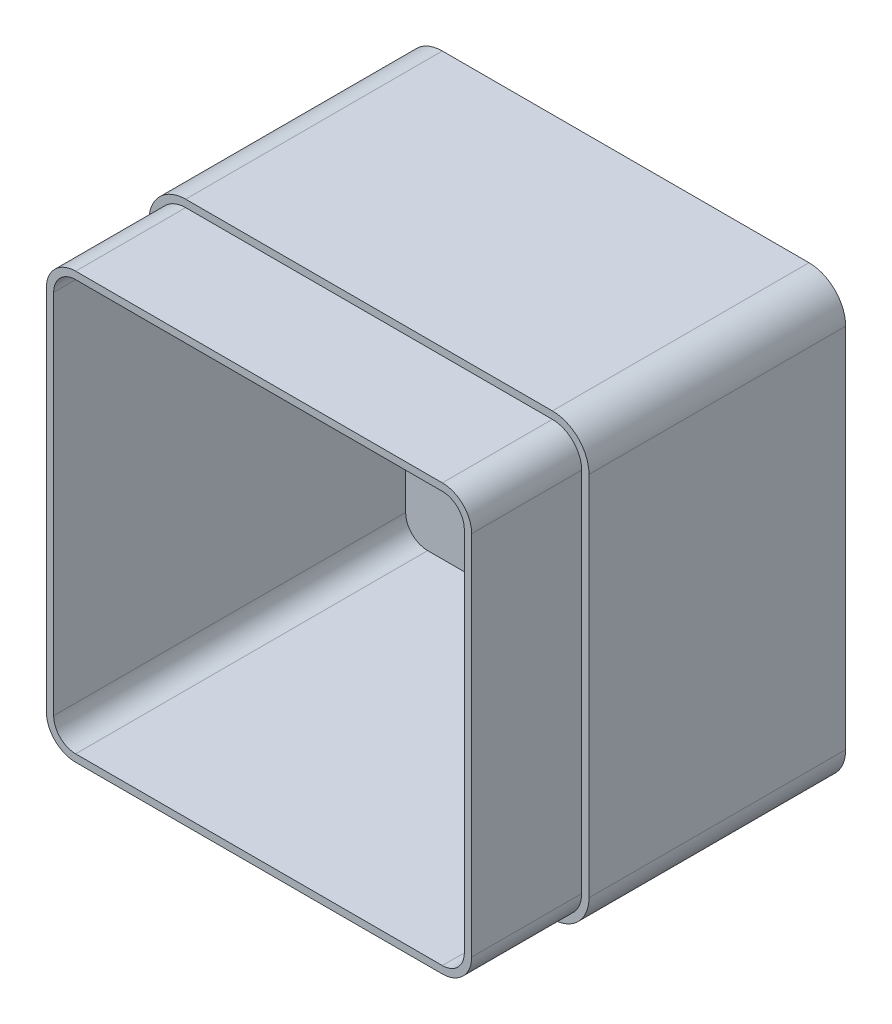
ISO-10303-21;
HEADER;
FILE_DESCRIPTION(('STEP AP214'),'2;1');
FILE_NAME('part.step','',(''),(''),'','','');
FILE_SCHEMA(('AUTOMOTIVE_DESIGN { 1 0 10303 214 1 1 1 1 }'));
ENDSEC;
DATA;
#1=APPLICATION_CONTEXT('core data for automotive mechanical design processes');
#2=APPLICATION_PROTOCOL_DEFINITION('international standard','automotive_design',2000,#1);
#3=PRODUCT_CONTEXT('',#1,'mechanical');
#4=PRODUCT('Part','Part','',(#3));
#5=PRODUCT_RELATED_PRODUCT_CATEGORY('part','',(#4));
#6=PRODUCT_DEFINITION_FORMATION('','',#4);
#7=PRODUCT_DEFINITION_CONTEXT('part definition',#1,'design');
#8=PRODUCT_DEFINITION('design','',#6,#7);
#9=PRODUCT_DEFINITION_SHAPE('','',#8);
#10=(LENGTH_UNIT() NAMED_UNIT(*) SI_UNIT(.MILLI.,.METRE.));
#11=(NAMED_UNIT(*) PLANE_ANGLE_UNIT() SI_UNIT($,.RADIAN.));
#12=(NAMED_UNIT(*) SI_UNIT($,.STERADIAN.) SOLID_ANGLE_UNIT());
#13=UNCERTAINTY_MEASURE_WITH_UNIT(LENGTH_MEASURE(1.E-05),#10,'distance_accuracy_value','');
#14=(GEOMETRIC_REPRESENTATION_CONTEXT(3) GLOBAL_UNCERTAINTY_ASSIGNED_CONTEXT((#13)) GLOBAL_UNIT_ASSIGNED_CONTEXT((#10,
#11,#12)) REPRESENTATION_CONTEXT('',''));
#15=CARTESIAN_POINT('',(0.,0.,0.));
#16=DIRECTION('',(0.,0.,1.));
#17=DIRECTION('',(1.,0.,0.));
#18=AXIS2_PLACEMENT_3D('',#15,#16,#17);
#19=CARTESIAN_POINT('',(0.,0.,4.));
#20=DIRECTION('',(0.,0.,-1.));
#21=DIRECTION('',(-1.,0.,0.));
#22=AXIS2_PLACEMENT_3D('',#19,#20,#21);
#23=PLANE('',#22);
#24=DIRECTION('',(1.,0.,0.));
#25=VECTOR('',#24,1.);
#26=CARTESIAN_POINT('',(0.,-56.,4.));
#27=LINE('',#26,#25);
#28=CARTESIAN_POINT('',(-50.,-56.,4.));
#29=VERTEX_POINT('',#28);
#30=CARTESIAN_POINT('',(50.,-56.,4.));
#31=VERTEX_POINT('',#30);
#32=EDGE_CURVE('E310',#29,#31,#27,.T.);
#33=ORIENTED_EDGE('',*,*,#32,.T.);
#34=CARTESIAN_POINT('',(50.,-50.,4.));
#35=DIRECTION('',(0.,0.,-1.));
#36=DIRECTION('',(-1.,0.,0.));
#37=AXIS2_PLACEMENT_3D('',#34,#35,#36);
#38=CIRCLE('',#37,6.);
#39=CARTESIAN_POINT('',(56.,-50.,4.));
#40=VERTEX_POINT('',#39);
#41=EDGE_CURVE('E322',#40,#31,#38,.T.);
#42=ORIENTED_EDGE('',*,*,#41,.F.);
#43=DIRECTION('',(0.,1.,0.));
#44=VECTOR('',#43,1.);
#45=CARTESIAN_POINT('',(56.,0.,4.));
#46=LINE('',#45,#44);
#47=CARTESIAN_POINT('',(56.,50.,4.));
#48=VERTEX_POINT('',#47);
#49=EDGE_CURVE('E302',#40,#48,#46,.T.);
#50=ORIENTED_EDGE('',*,*,#49,.T.);
#51=CARTESIAN_POINT('',(50.,50.,4.));
#52=DIRECTION('',(0.,0.,-1.));
#53=DIRECTION('',(-1.,0.,0.));
#54=AXIS2_PLACEMENT_3D('',#51,#52,#53);
#55=CIRCLE('',#54,6.);
#56=CARTESIAN_POINT('',(50.,56.,4.));
#57=VERTEX_POINT('',#56);
#58=EDGE_CURVE('E324',#57,#48,#55,.T.);
#59=ORIENTED_EDGE('',*,*,#58,.F.);
#60=DIRECTION('',(-1.,0.,0.));
#61=VECTOR('',#60,1.);
#62=CARTESIAN_POINT('',(0.,56.,4.));
#63=LINE('',#62,#61);
#64=CARTESIAN_POINT('',(-50.,56.,4.));
#65=VERTEX_POINT('',#64);
#66=EDGE_CURVE('E208',#57,#65,#63,.T.);
#67=ORIENTED_EDGE('',*,*,#66,.T.);
#68=CARTESIAN_POINT('',(-50.,50.,4.));
#69=DIRECTION('',(0.,0.,-1.));
#70=DIRECTION('',(-1.,0.,0.));
#71=AXIS2_PLACEMENT_3D('',#68,#69,#70);
#72=CIRCLE('',#71,6.);
#73=CARTESIAN_POINT('',(-56.,50.,4.));
#74=VERTEX_POINT('',#73);
#75=EDGE_CURVE('E318',#74,#65,#72,.T.);
#76=ORIENTED_EDGE('',*,*,#75,.F.);
#77=DIRECTION('',(0.,-1.,0.));
#78=VECTOR('',#77,1.);
#79=CARTESIAN_POINT('',(-56.,0.,4.));
#80=LINE('',#79,#78);
#81=CARTESIAN_POINT('',(-56.,-50.,4.));
#82=VERTEX_POINT('',#81);
#83=EDGE_CURVE('E314',#74,#82,#80,.T.);
#84=ORIENTED_EDGE('',*,*,#83,.T.);
#85=CARTESIAN_POINT('',(-50.,-50.,4.));
#86=DIRECTION('',(0.,0.,-1.));
#87=DIRECTION('',(-1.,0.,0.));
#88=AXIS2_PLACEMENT_3D('',#85,#86,#87);
#89=CIRCLE('',#88,6.);
#90=EDGE_CURVE('E315',#29,#82,#89,.T.);
#91=ORIENTED_EDGE('',*,*,#90,.F.);
#92=EDGE_LOOP('',(#33,#42,#50,#59,#67,#76,#84,#91));
#93=FACE_BOUND('',#92,.T.);
#94=ADVANCED_FACE('F38',(#93),#23,.F.);
#95=CARTESIAN_POINT('',(-50.,-50.,70.));
#96=DIRECTION('',(0.,0.,-1.));
#97=DIRECTION('',(-1.,0.,0.));
#98=AXIS2_PLACEMENT_3D('',#95,#96,#97);
#99=CYLINDRICAL_SURFACE('',#98,6.);
#100=DIRECTION('',(0.,0.,-1.));
#101=VECTOR('',#100,1.);
#102=CARTESIAN_POINT('',(-56.,-50.,70.));
#103=LINE('',#102,#101);
#104=CARTESIAN_POINT('',(-56.,-50.,99.9999999999999));
#105=VERTEX_POINT('',#104);
#106=EDGE_CURVE('E210',#82,#105,#103,.F.);
#107=ORIENTED_EDGE('',*,*,#106,.T.);
#108=CARTESIAN_POINT('',(-50.,-50.,99.9999999999999));
#109=DIRECTION('',(0.,0.,1.));
#110=DIRECTION('',(1.,0.,0.));
#111=AXIS2_PLACEMENT_3D('',#108,#109,#110);
#112=CIRCLE('',#111,5.99999999999998);
#113=CARTESIAN_POINT('',(-50.,-56.,99.9999999999999));
#114=VERTEX_POINT('',#113);
#115=EDGE_CURVE('E231',#105,#114,#112,.T.);
#116=ORIENTED_EDGE('',*,*,#115,.T.);
#117=DIRECTION('',(0.,0.,1.));
#118=VECTOR('',#117,1.);
#119=CARTESIAN_POINT('',(-50.,-56.,70.));
#120=LINE('',#119,#118);
#121=EDGE_CURVE('E326',#114,#29,#120,.F.);
#122=ORIENTED_EDGE('',*,*,#121,.T.);
#123=ORIENTED_EDGE('',*,*,#90,.T.);
#124=EDGE_LOOP('',(#107,#116,#122,#123));
#125=FACE_BOUND('',#124,.T.);
#126=ADVANCED_FACE('F434',(#125),#99,.F.);
#127=CARTESIAN_POINT('',(-60.,-56.,70.));
#128=DIRECTION('',(0.,1.,0.));
#129=DIRECTION('',(0.,0.,1.));
#130=AXIS2_PLACEMENT_3D('',#127,#128,#129);
#131=PLANE('',#130);
#132=ORIENTED_EDGE('',*,*,#121,.F.);
#133=DIRECTION('',(1.,0.,0.));
#134=VECTOR('',#133,1.);
#135=CARTESIAN_POINT('',(-50.,-56.,99.9999999999999));
#136=LINE('',#135,#134);
#137=CARTESIAN_POINT('',(50.,-56.,99.9999999999999));
#138=VERTEX_POINT('',#137);
#139=EDGE_CURVE('E234',#114,#138,#136,.T.);
#140=ORIENTED_EDGE('',*,*,#139,.T.);
#141=DIRECTION('',(0.,0.,1.));
#142=VECTOR('',#141,1.);
#143=CARTESIAN_POINT('',(50.,-56.,70.));
#144=LINE('',#143,#142);
#145=EDGE_CURVE('E313',#31,#138,#144,.T.);
#146=ORIENTED_EDGE('',*,*,#145,.F.);
#147=ORIENTED_EDGE('',*,*,#32,.F.);
#148=EDGE_LOOP('',(#132,#140,#146,#147));
#149=FACE_BOUND('',#148,.T.);
#150=ADVANCED_FACE('F440',(#149),#131,.T.);
#151=CARTESIAN_POINT('',(50.,-50.,70.));
#152=DIRECTION('',(0.,0.,-1.));
#153=DIRECTION('',(-1.,0.,0.));
#154=AXIS2_PLACEMENT_3D('',#151,#152,#153);
#155=CYLINDRICAL_SURFACE('',#154,6.);
#156=ORIENTED_EDGE('',*,*,#145,.T.);
#157=CARTESIAN_POINT('',(50.,-50.,99.9999999999999));
#158=DIRECTION('',(0.,0.,1.));
#159=DIRECTION('',(1.,0.,0.));
#160=AXIS2_PLACEMENT_3D('',#157,#158,#159);
#161=CIRCLE('',#160,5.99999999999998);
#162=CARTESIAN_POINT('',(56.,-50.,99.9999999999999));
#163=VERTEX_POINT('',#162);
#164=EDGE_CURVE('E237',#138,#163,#161,.T.);
#165=ORIENTED_EDGE('',*,*,#164,.T.);
#166=DIRECTION('',(0.,0.,1.));
#167=VECTOR('',#166,1.);
#168=CARTESIAN_POINT('',(56.,-50.,70.));
#169=LINE('',#168,#167);
#170=EDGE_CURVE('E303',#163,#40,#169,.F.);
#171=ORIENTED_EDGE('',*,*,#170,.T.);
#172=ORIENTED_EDGE('',*,*,#41,.T.);
#173=EDGE_LOOP('',(#156,#165,#171,#172));
#174=FACE_BOUND('',#173,.T.);
#175=ADVANCED_FACE('F451',(#174),#155,.F.);
#176=CARTESIAN_POINT('',(56.,-60.,70.));
#177=DIRECTION('',(-1.,0.,0.));
#178=DIRECTION('',(0.,0.,1.));
#179=AXIS2_PLACEMENT_3D('',#176,#177,#178);
#180=PLANE('',#179);
#181=ORIENTED_EDGE('',*,*,#170,.F.);
#182=DIRECTION('',(0.,1.,0.));
#183=VECTOR('',#182,1.);
#184=CARTESIAN_POINT('',(56.,-50.,99.9999999999999));
#185=LINE('',#184,#183);
#186=CARTESIAN_POINT('',(56.,50.,99.9999999999999));
#187=VERTEX_POINT('',#186);
#188=EDGE_CURVE('E217',#163,#187,#185,.T.);
#189=ORIENTED_EDGE('',*,*,#188,.T.);
#190=DIRECTION('',(0.,0.,1.));
#191=VECTOR('',#190,1.);
#192=CARTESIAN_POINT('',(56.,50.,70.));
#193=LINE('',#192,#191);
#194=EDGE_CURVE('E53',#48,#187,#193,.T.);
#195=ORIENTED_EDGE('',*,*,#194,.F.);
#196=ORIENTED_EDGE('',*,*,#49,.F.);
#197=EDGE_LOOP('',(#181,#189,#195,#196));
#198=FACE_BOUND('',#197,.T.);
#199=ADVANCED_FACE('F454',(#198),#180,.T.);
#200=CARTESIAN_POINT('',(50.,50.,70.));
#201=DIRECTION('',(0.,0.,-1.));
#202=DIRECTION('',(-1.,0.,0.));
#203=AXIS2_PLACEMENT_3D('',#200,#201,#202);
#204=CYLINDRICAL_SURFACE('',#203,6.);
#205=ORIENTED_EDGE('',*,*,#194,.T.);
#206=CARTESIAN_POINT('',(50.,50.,99.9999999999999));
#207=DIRECTION('',(0.,0.,1.));
#208=DIRECTION('',(1.,0.,0.));
#209=AXIS2_PLACEMENT_3D('',#206,#207,#208);
#210=CIRCLE('',#209,5.99999999999998);
#211=CARTESIAN_POINT('',(50.,56.,99.9999999999999));
#212=VERTEX_POINT('',#211);
#213=EDGE_CURVE('E213',#187,#212,#210,.T.);
#214=ORIENTED_EDGE('',*,*,#213,.T.);
#215=DIRECTION('',(0.,0.,-1.));
#216=VECTOR('',#215,1.);
#217=CARTESIAN_POINT('',(50.,56.,70.));
#218=LINE('',#217,#216);
#219=EDGE_CURVE('E201',#212,#57,#218,.T.);
#220=ORIENTED_EDGE('',*,*,#219,.T.);
#221=ORIENTED_EDGE('',*,*,#58,.T.);
#222=EDGE_LOOP('',(#205,#214,#220,#221));
#223=FACE_BOUND('',#222,.T.);
#224=ADVANCED_FACE('F214',(#223),#204,.F.);
#225=CARTESIAN_POINT('',(-60.,56.,70.));
#226=DIRECTION('',(0.,-1.,0.));
#227=DIRECTION('',(0.,0.,-1.));
#228=AXIS2_PLACEMENT_3D('',#225,#226,#227);
#229=PLANE('',#228);
#230=ORIENTED_EDGE('',*,*,#66,.F.);
#231=ORIENTED_EDGE('',*,*,#219,.F.);
#232=DIRECTION('',(-1.,0.,0.));
#233=VECTOR('',#232,1.);
#234=CARTESIAN_POINT('',(50.,56.,99.9999999999999));
#235=LINE('',#234,#233);
#236=CARTESIAN_POINT('',(-50.,56.,99.9999999999999));
#237=VERTEX_POINT('',#236);
#238=EDGE_CURVE('E205',#212,#237,#235,.T.);
#239=ORIENTED_EDGE('',*,*,#238,.T.);
#240=DIRECTION('',(0.,0.,-1.));
#241=VECTOR('',#240,1.);
#242=CARTESIAN_POINT('',(-50.,56.,70.));
#243=LINE('',#242,#241);
#244=EDGE_CURVE('E209',#65,#237,#243,.F.);
#245=ORIENTED_EDGE('',*,*,#244,.F.);
#246=EDGE_LOOP('',(#230,#231,#239,#245));
#247=FACE_BOUND('',#246,.T.);
#248=ADVANCED_FACE('F202',(#247),#229,.T.);
#249=CARTESIAN_POINT('',(-50.,50.,70.));
#250=DIRECTION('',(0.,0.,-1.));
#251=DIRECTION('',(-1.,0.,0.));
#252=AXIS2_PLACEMENT_3D('',#249,#250,#251);
#253=CYLINDRICAL_SURFACE('',#252,6.);
#254=ORIENTED_EDGE('',*,*,#244,.T.);
#255=CARTESIAN_POINT('',(-50.,50.,99.9999999999999));
#256=DIRECTION('',(0.,0.,1.));
#257=DIRECTION('',(1.,0.,0.));
#258=AXIS2_PLACEMENT_3D('',#255,#256,#257);
#259=CIRCLE('',#258,5.99999999999999);
#260=CARTESIAN_POINT('',(-56.,50.,99.9999999999999));
#261=VERTEX_POINT('',#260);
#262=EDGE_CURVE('E223',#237,#261,#259,.T.);
#263=ORIENTED_EDGE('',*,*,#262,.T.);
#264=DIRECTION('',(0.,0.,-1.));
#265=VECTOR('',#264,1.);
#266=CARTESIAN_POINT('',(-56.,50.,70.));
#267=LINE('',#266,#265);
#268=EDGE_CURVE('E317',#261,#74,#267,.T.);
#269=ORIENTED_EDGE('',*,*,#268,.T.);
#270=ORIENTED_EDGE('',*,*,#75,.T.);
#271=EDGE_LOOP('',(#254,#263,#269,#270));
#272=FACE_BOUND('',#271,.T.);
#273=ADVANCED_FACE('F446',(#272),#253,.F.);
#274=CARTESIAN_POINT('',(-56.,-60.,70.));
#275=DIRECTION('',(1.,0.,0.));
#276=DIRECTION('',(0.,0.,-1.));
#277=AXIS2_PLACEMENT_3D('',#274,#275,#276);
#278=PLANE('',#277);
#279=ORIENTED_EDGE('',*,*,#83,.F.);
#280=ORIENTED_EDGE('',*,*,#268,.F.);
#281=DIRECTION('',(0.,-1.,0.));
#282=VECTOR('',#281,1.);
#283=CARTESIAN_POINT('',(-56.,50.,99.9999999999999));
#284=LINE('',#283,#282);
#285=EDGE_CURVE('E225',#261,#105,#284,.T.);
#286=ORIENTED_EDGE('',*,*,#285,.T.);
#287=ORIENTED_EDGE('',*,*,#106,.F.);
#288=EDGE_LOOP('',(#279,#280,#286,#287));
#289=FACE_BOUND('',#288,.T.);
#290=ADVANCED_FACE('F449',(#289),#278,.T.);
#291=CARTESIAN_POINT('',(0.,0.,70.));
#292=DIRECTION('',(0.,0.,-1.));
#293=DIRECTION('',(-1.,0.,0.));
#294=AXIS2_PLACEMENT_3D('',#291,#292,#293);
#295=PLANE('',#294);
#296=DIRECTION('',(0.,-1.,0.));
#297=VECTOR('',#296,1.);
#298=CARTESIAN_POINT('',(-60.,-60.,70.));
#299=LINE('',#298,#297);
#300=CARTESIAN_POINT('',(-60.,50.,70.));
#301=VERTEX_POINT('',#300);
#302=CARTESIAN_POINT('',(-60.,-50.,70.));
#303=VERTEX_POINT('',#302);
#304=EDGE_CURVE('E342',#301,#303,#299,.T.);
#305=ORIENTED_EDGE('',*,*,#304,.T.);
#306=CARTESIAN_POINT('',(-50.,-50.,70.));
#307=DIRECTION('',(0.,0.,-1.));
#308=DIRECTION('',(-1.,0.,0.));
#309=AXIS2_PLACEMENT_3D('',#306,#307,#308);
#310=CIRCLE('',#309,10.);
#311=CARTESIAN_POINT('',(-50.,-60.,70.));
#312=VERTEX_POINT('',#311);
#313=EDGE_CURVE('E382',#303,#312,#310,.F.);
#314=ORIENTED_EDGE('',*,*,#313,.T.);
#315=DIRECTION('',(1.,0.,0.));
#316=VECTOR('',#315,1.);
#317=CARTESIAN_POINT('',(-60.,-60.,70.));
#318=LINE('',#317,#316);
#319=CARTESIAN_POINT('',(50.,-60.,70.));
#320=VERTEX_POINT('',#319);
#321=EDGE_CURVE('E345',#312,#320,#318,.T.);
#322=ORIENTED_EDGE('',*,*,#321,.T.);
#323=CARTESIAN_POINT('',(50.,-50.,70.));
#324=DIRECTION('',(0.,0.,-1.));
#325=DIRECTION('',(-1.,0.,0.));
#326=AXIS2_PLACEMENT_3D('',#323,#324,#325);
#327=CIRCLE('',#326,10.);
#328=CARTESIAN_POINT('',(60.,-50.,70.));
#329=VERTEX_POINT('',#328);
#330=EDGE_CURVE('E378',#320,#329,#327,.F.);
#331=ORIENTED_EDGE('',*,*,#330,.T.);
#332=DIRECTION('',(0.,1.,0.));
#333=VECTOR('',#332,1.);
#334=CARTESIAN_POINT('',(60.,-60.,70.));
#335=LINE('',#334,#333);
#336=CARTESIAN_POINT('',(60.,50.,70.));
#337=VERTEX_POINT('',#336);
#338=EDGE_CURVE('E335',#329,#337,#335,.T.);
#339=ORIENTED_EDGE('',*,*,#338,.T.);
#340=CARTESIAN_POINT('',(50.,50.,70.));
#341=DIRECTION('',(0.,0.,-1.));
#342=DIRECTION('',(-1.,0.,0.));
#343=AXIS2_PLACEMENT_3D('',#340,#341,#342);
#344=CIRCLE('',#343,10.);
#345=CARTESIAN_POINT('',(50.,60.,70.));
#346=VERTEX_POINT('',#345);
#347=EDGE_CURVE('E376',#337,#346,#344,.F.);
#348=ORIENTED_EDGE('',*,*,#347,.T.);
#349=DIRECTION('',(-1.,0.,0.));
#350=VECTOR('',#349,1.);
#351=CARTESIAN_POINT('',(-60.,60.,70.));
#352=LINE('',#351,#350);
#353=CARTESIAN_POINT('',(-50.,60.,70.));
#354=VERTEX_POINT('',#353);
#355=EDGE_CURVE('E338',#346,#354,#352,.T.);
#356=ORIENTED_EDGE('',*,*,#355,.T.);
#357=CARTESIAN_POINT('',(-50.,50.,70.));
#358=DIRECTION('',(0.,0.,-1.));
#359=DIRECTION('',(-1.,0.,0.));
#360=AXIS2_PLACEMENT_3D('',#357,#358,#359);
#361=CIRCLE('',#360,10.);
#362=EDGE_CURVE('E380',#354,#301,#361,.F.);
#363=ORIENTED_EDGE('',*,*,#362,.T.);
#364=EDGE_LOOP('',(#305,#314,#322,#331,#339,#348,#356,#363));
#365=FACE_BOUND('',#364,.T.);
#366=CARTESIAN_POINT('',(50.,50.,70.));
#367=DIRECTION('',(0.,0.,1.));
#368=DIRECTION('',(1.,0.,0.));
#369=AXIS2_PLACEMENT_3D('',#366,#367,#368);
#370=CIRCLE('',#369,8.);
#371=CARTESIAN_POINT('',(58.,50.,70.));
#372=VERTEX_POINT('',#371);
#373=CARTESIAN_POINT('',(50.,58.,70.));
#374=VERTEX_POINT('',#373);
#375=EDGE_CURVE('E61',#372,#374,#370,.T.);
#376=ORIENTED_EDGE('',*,*,#375,.F.);
#377=DIRECTION('',(0.,1.,0.));
#378=VECTOR('',#377,1.);
#379=CARTESIAN_POINT('',(58.,-50.,70.));
#380=LINE('',#379,#378);
#381=CARTESIAN_POINT('',(58.,-50.,70.));
#382=VERTEX_POINT('',#381);
#383=EDGE_CURVE('E244',#382,#372,#380,.T.);
#384=ORIENTED_EDGE('',*,*,#383,.F.);
#385=CARTESIAN_POINT('',(50.,-50.,70.));
#386=DIRECTION('',(0.,0.,1.));
#387=DIRECTION('',(1.,0.,0.));
#388=AXIS2_PLACEMENT_3D('',#385,#386,#387);
#389=CIRCLE('',#388,7.99999999999999);
#390=CARTESIAN_POINT('',(50.,-58.,70.));
#391=VERTEX_POINT('',#390);
#392=EDGE_CURVE('E275',#391,#382,#389,.T.);
#393=ORIENTED_EDGE('',*,*,#392,.F.);
#394=DIRECTION('',(1.,0.,0.));
#395=VECTOR('',#394,1.);
#396=CARTESIAN_POINT('',(-50.,-58.,70.));
#397=LINE('',#396,#395);
#398=CARTESIAN_POINT('',(-50.,-58.,70.));
#399=VERTEX_POINT('',#398);
#400=EDGE_CURVE('E272',#399,#391,#397,.T.);
#401=ORIENTED_EDGE('',*,*,#400,.F.);
#402=CARTESIAN_POINT('',(-50.,-50.,70.));
#403=DIRECTION('',(0.,0.,1.));
#404=DIRECTION('',(1.,0.,0.));
#405=AXIS2_PLACEMENT_3D('',#402,#403,#404);
#406=CIRCLE('',#405,7.99999999999999);
#407=CARTESIAN_POINT('',(-58.,-50.,70.));
#408=VERTEX_POINT('',#407);
#409=EDGE_CURVE('E269',#408,#399,#406,.T.);
#410=ORIENTED_EDGE('',*,*,#409,.F.);
#411=DIRECTION('',(0.,-1.,0.));
#412=VECTOR('',#411,1.);
#413=CARTESIAN_POINT('',(-58.,50.,70.));
#414=LINE('',#413,#412);
#415=CARTESIAN_POINT('',(-58.,50.,70.));
#416=VERTEX_POINT('',#415);
#417=EDGE_CURVE('E266',#416,#408,#414,.T.);
#418=ORIENTED_EDGE('',*,*,#417,.F.);
#419=CARTESIAN_POINT('',(-50.,50.,70.));
#420=DIRECTION('',(0.,0.,1.));
#421=DIRECTION('',(1.,0.,0.));
#422=AXIS2_PLACEMENT_3D('',#419,#420,#421);
#423=CIRCLE('',#422,8.);
#424=CARTESIAN_POINT('',(-50.,58.,70.));
#425=VERTEX_POINT('',#424);
#426=EDGE_CURVE('E263',#425,#416,#423,.T.);
#427=ORIENTED_EDGE('',*,*,#426,.F.);
#428=DIRECTION('',(-1.,0.,0.));
#429=VECTOR('',#428,1.);
#430=CARTESIAN_POINT('',(50.,58.,70.));
#431=LINE('',#430,#429);
#432=EDGE_CURVE('E260',#374,#425,#431,.T.);
#433=ORIENTED_EDGE('',*,*,#432,.F.);
#434=EDGE_LOOP('',(#376,#384,#393,#401,#410,#418,#427,#433));
#435=FACE_BOUND('',#434,.T.);
#436=ADVANCED_FACE('F397',(#365,#435),#295,.F.);
#437=CARTESIAN_POINT('',(60.,-60.,70.));
#438=DIRECTION('',(-1.,0.,0.));
#439=DIRECTION('',(0.,0.,1.));
#440=AXIS2_PLACEMENT_3D('',#437,#438,#439);
#441=PLANE('',#440);
#442=ORIENTED_EDGE('',*,*,#338,.F.);
#443=DIRECTION('',(0.,0.,-1.));
#444=VECTOR('',#443,1.);
#445=CARTESIAN_POINT('',(60.,-50.,70.));
#446=LINE('',#445,#444);
#447=CARTESIAN_POINT('',(60.,-50.,0.));
#448=VERTEX_POINT('',#447);
#449=EDGE_CURVE('E11',#329,#448,#446,.T.);
#450=ORIENTED_EDGE('',*,*,#449,.T.);
#451=DIRECTION('',(0.,1.,0.));
#452=VECTOR('',#451,1.);
#453=CARTESIAN_POINT('',(60.,-60.,0.));
#454=LINE('',#453,#452);
#455=CARTESIAN_POINT('',(60.,50.,0.));
#456=VERTEX_POINT('',#455);
#457=EDGE_CURVE('E306',#448,#456,#454,.T.);
#458=ORIENTED_EDGE('',*,*,#457,.T.);
#459=DIRECTION('',(0.,0.,-1.));
#460=VECTOR('',#459,1.);
#461=CARTESIAN_POINT('',(60.,50.,70.));
#462=LINE('',#461,#460);
#463=EDGE_CURVE('E46',#456,#337,#462,.F.);
#464=ORIENTED_EDGE('',*,*,#463,.T.);
#465=EDGE_LOOP('',(#442,#450,#458,#464));
#466=FACE_BOUND('',#465,.T.);
#467=ADVANCED_FACE('F391',(#466),#441,.F.);
#468=CARTESIAN_POINT('',(-60.,60.,70.));
#469=DIRECTION('',(0.,-1.,0.));
#470=DIRECTION('',(0.,0.,-1.));
#471=AXIS2_PLACEMENT_3D('',#468,#469,#470);
#472=PLANE('',#471);
#473=DIRECTION('',(-1.,0.,0.));
#474=VECTOR('',#473,1.);
#475=CARTESIAN_POINT('',(-60.,60.,0.));
#476=LINE('',#475,#474);
#477=CARTESIAN_POINT('',(50.,60.,0.));
#478=VERTEX_POINT('',#477);
#479=CARTESIAN_POINT('',(-50.,60.,0.));
#480=VERTEX_POINT('',#479);
#481=EDGE_CURVE('E351',#478,#480,#476,.T.);
#482=ORIENTED_EDGE('',*,*,#481,.T.);
#483=DIRECTION('',(0.,0.,-1.));
#484=VECTOR('',#483,1.);
#485=CARTESIAN_POINT('',(-50.,60.,70.));
#486=LINE('',#485,#484);
#487=EDGE_CURVE('E387',#480,#354,#486,.F.);
#488=ORIENTED_EDGE('',*,*,#487,.T.);
#489=ORIENTED_EDGE('',*,*,#355,.F.);
#490=DIRECTION('',(0.,0.,-1.));
#491=VECTOR('',#490,1.);
#492=CARTESIAN_POINT('',(50.,60.,70.));
#493=LINE('',#492,#491);
#494=EDGE_CURVE('E384',#346,#478,#493,.T.);
#495=ORIENTED_EDGE('',*,*,#494,.T.);
#496=EDGE_LOOP('',(#482,#488,#489,#495));
#497=FACE_BOUND('',#496,.T.);
#498=ADVANCED_FACE('F403',(#497),#472,.F.);
#499=CARTESIAN_POINT('',(-60.,-60.,70.));
#500=DIRECTION('',(1.,0.,0.));
#501=DIRECTION('',(0.,0.,-1.));
#502=AXIS2_PLACEMENT_3D('',#499,#500,#501);
#503=PLANE('',#502);
#504=DIRECTION('',(0.,-1.,0.));
#505=VECTOR('',#504,1.);
#506=CARTESIAN_POINT('',(-60.,-60.,0.));
#507=LINE('',#506,#505);
#508=CARTESIAN_POINT('',(-60.,50.,0.));
#509=VERTEX_POINT('',#508);
#510=CARTESIAN_POINT('',(-60.,-50.,0.));
#511=VERTEX_POINT('',#510);
#512=EDGE_CURVE('E354',#509,#511,#507,.T.);
#513=ORIENTED_EDGE('',*,*,#512,.T.);
#514=DIRECTION('',(0.,0.,-1.));
#515=VECTOR('',#514,1.);
#516=CARTESIAN_POINT('',(-60.,-50.,70.));
#517=LINE('',#516,#515);
#518=EDGE_CURVE('E374',#511,#303,#517,.F.);
#519=ORIENTED_EDGE('',*,*,#518,.T.);
#520=ORIENTED_EDGE('',*,*,#304,.F.);
#521=DIRECTION('',(0.,0.,-1.));
#522=VECTOR('',#521,1.);
#523=CARTESIAN_POINT('',(-60.,50.,70.));
#524=LINE('',#523,#522);
#525=EDGE_CURVE('E371',#301,#509,#524,.T.);
#526=ORIENTED_EDGE('',*,*,#525,.T.);
#527=EDGE_LOOP('',(#513,#519,#520,#526));
#528=FACE_BOUND('',#527,.T.);
#529=ADVANCED_FACE('F415',(#528),#503,.F.);
#530=CARTESIAN_POINT('',(-60.,-60.,70.));
#531=DIRECTION('',(0.,1.,0.));
#532=DIRECTION('',(0.,0.,1.));
#533=AXIS2_PLACEMENT_3D('',#530,#531,#532);
#534=PLANE('',#533);
#535=ORIENTED_EDGE('',*,*,#321,.F.);
#536=DIRECTION('',(0.,0.,-1.));
#537=VECTOR('',#536,1.);
#538=CARTESIAN_POINT('',(-50.,-60.,70.));
#539=LINE('',#538,#537);
#540=CARTESIAN_POINT('',(-50.,-60.,0.));
#541=VERTEX_POINT('',#540);
#542=EDGE_CURVE('E360',#312,#541,#539,.T.);
#543=ORIENTED_EDGE('',*,*,#542,.T.);
#544=DIRECTION('',(1.,0.,0.));
#545=VECTOR('',#544,1.);
#546=CARTESIAN_POINT('',(-60.,-60.,0.));
#547=LINE('',#546,#545);
#548=CARTESIAN_POINT('',(50.,-60.,0.));
#549=VERTEX_POINT('',#548);
#550=EDGE_CURVE('E339',#541,#549,#547,.T.);
#551=ORIENTED_EDGE('',*,*,#550,.T.);
#552=DIRECTION('',(0.,0.,-1.));
#553=VECTOR('',#552,1.);
#554=CARTESIAN_POINT('',(50.,-60.,70.));
#555=LINE('',#554,#553);
#556=EDGE_CURVE('E348',#549,#320,#555,.F.);
#557=ORIENTED_EDGE('',*,*,#556,.T.);
#558=EDGE_LOOP('',(#535,#543,#551,#557));
#559=FACE_BOUND('',#558,.T.);
#560=ADVANCED_FACE('F423',(#559),#534,.F.);
#561=CARTESIAN_POINT('',(0.,0.,0.));
#562=DIRECTION('',(0.,0.,-1.));
#563=DIRECTION('',(-1.,0.,0.));
#564=AXIS2_PLACEMENT_3D('',#561,#562,#563);
#565=PLANE('',#564);
#566=ORIENTED_EDGE('',*,*,#550,.F.);
#567=CARTESIAN_POINT('',(-50.,-50.,0.));
#568=DIRECTION('',(0.,0.,-1.));
#569=DIRECTION('',(-1.,0.,0.));
#570=AXIS2_PLACEMENT_3D('',#567,#568,#569);
#571=CIRCLE('',#570,10.);
#572=EDGE_CURVE('E369',#541,#511,#571,.T.);
#573=ORIENTED_EDGE('',*,*,#572,.T.);
#574=ORIENTED_EDGE('',*,*,#512,.F.);
#575=CARTESIAN_POINT('',(-50.,50.,0.));
#576=DIRECTION('',(0.,0.,-1.));
#577=DIRECTION('',(-1.,0.,0.));
#578=AXIS2_PLACEMENT_3D('',#575,#576,#577);
#579=CIRCLE('',#578,10.);
#580=EDGE_CURVE('E367',#509,#480,#579,.T.);
#581=ORIENTED_EDGE('',*,*,#580,.T.);
#582=ORIENTED_EDGE('',*,*,#481,.F.);
#583=CARTESIAN_POINT('',(50.,50.,0.));
#584=DIRECTION('',(0.,0.,-1.));
#585=DIRECTION('',(-1.,0.,0.));
#586=AXIS2_PLACEMENT_3D('',#583,#584,#585);
#587=CIRCLE('',#586,10.);
#588=EDGE_CURVE('E363',#478,#456,#587,.T.);
#589=ORIENTED_EDGE('',*,*,#588,.T.);
#590=ORIENTED_EDGE('',*,*,#457,.F.);
#591=CARTESIAN_POINT('',(50.,-50.,0.));
#592=DIRECTION('',(0.,0.,-1.));
#593=DIRECTION('',(-1.,0.,0.));
#594=AXIS2_PLACEMENT_3D('',#591,#592,#593);
#595=CIRCLE('',#594,10.);
#596=EDGE_CURVE('E365',#448,#549,#595,.T.);
#597=ORIENTED_EDGE('',*,*,#596,.T.);
#598=EDGE_LOOP('',(#566,#573,#574,#581,#582,#589,#590,#597));
#599=FACE_BOUND('',#598,.T.);
#600=ADVANCED_FACE('F407',(#599),#565,.T.);
#601=CARTESIAN_POINT('',(-50.,-50.,70.));
#602=DIRECTION('',(0.,0.,-1.));
#603=DIRECTION('',(-1.,0.,0.));
#604=AXIS2_PLACEMENT_3D('',#601,#602,#603);
#605=CYLINDRICAL_SURFACE('',#604,10.);
#606=ORIENTED_EDGE('',*,*,#313,.F.);
#607=ORIENTED_EDGE('',*,*,#518,.F.);
#608=ORIENTED_EDGE('',*,*,#572,.F.);
#609=ORIENTED_EDGE('',*,*,#542,.F.);
#610=EDGE_LOOP('',(#606,#607,#608,#609));
#611=FACE_BOUND('',#610,.T.);
#612=ADVANCED_FACE('F421',(#611),#605,.T.);
#613=CARTESIAN_POINT('',(-50.,50.,70.));
#614=DIRECTION('',(0.,0.,-1.));
#615=DIRECTION('',(-1.,0.,0.));
#616=AXIS2_PLACEMENT_3D('',#613,#614,#615);
#617=CYLINDRICAL_SURFACE('',#616,10.);
#618=ORIENTED_EDGE('',*,*,#362,.F.);
#619=ORIENTED_EDGE('',*,*,#487,.F.);
#620=ORIENTED_EDGE('',*,*,#580,.F.);
#621=ORIENTED_EDGE('',*,*,#525,.F.);
#622=EDGE_LOOP('',(#618,#619,#620,#621));
#623=FACE_BOUND('',#622,.T.);
#624=ADVANCED_FACE('F412',(#623),#617,.T.);
#625=CARTESIAN_POINT('',(50.,-50.,70.));
#626=DIRECTION('',(0.,0.,-1.));
#627=DIRECTION('',(-1.,0.,0.));
#628=AXIS2_PLACEMENT_3D('',#625,#626,#627);
#629=CYLINDRICAL_SURFACE('',#628,10.);
#630=ORIENTED_EDGE('',*,*,#330,.F.);
#631=ORIENTED_EDGE('',*,*,#556,.F.);
#632=ORIENTED_EDGE('',*,*,#596,.F.);
#633=ORIENTED_EDGE('',*,*,#449,.F.);
#634=EDGE_LOOP('',(#630,#631,#632,#633));
#635=FACE_BOUND('',#634,.T.);
#636=ADVANCED_FACE('F426',(#635),#629,.T.);
#637=CARTESIAN_POINT('',(50.,50.,70.));
#638=DIRECTION('',(0.,0.,-1.));
#639=DIRECTION('',(-1.,0.,0.));
#640=AXIS2_PLACEMENT_3D('',#637,#638,#639);
#641=CYLINDRICAL_SURFACE('',#640,10.);
#642=ORIENTED_EDGE('',*,*,#347,.F.);
#643=ORIENTED_EDGE('',*,*,#463,.F.);
#644=ORIENTED_EDGE('',*,*,#588,.F.);
#645=ORIENTED_EDGE('',*,*,#494,.F.);
#646=EDGE_LOOP('',(#642,#643,#644,#645));
#647=FACE_BOUND('',#646,.T.);
#648=ADVANCED_FACE('F40',(#647),#641,.T.);
#649=CARTESIAN_POINT('',(50.,50.,99.9999999999999));
#650=DIRECTION('',(0.,0.,1.));
#651=DIRECTION('',(1.,0.,0.));
#652=AXIS2_PLACEMENT_3D('',#649,#650,#651);
#653=PLANE('',#652);
#654=ORIENTED_EDGE('',*,*,#188,.F.);
#655=ORIENTED_EDGE('',*,*,#164,.F.);
#656=ORIENTED_EDGE('',*,*,#139,.F.);
#657=ORIENTED_EDGE('',*,*,#115,.F.);
#658=ORIENTED_EDGE('',*,*,#285,.F.);
#659=ORIENTED_EDGE('',*,*,#262,.F.);
#660=ORIENTED_EDGE('',*,*,#238,.F.);
#661=ORIENTED_EDGE('',*,*,#213,.F.);
#662=EDGE_LOOP('',(#654,#655,#656,#657,#658,#659,#660,#661));
#663=FACE_BOUND('',#662,.T.);
#664=CARTESIAN_POINT('',(50.,50.,99.9999999999999));
#665=DIRECTION('',(0.,0.,1.));
#666=DIRECTION('',(1.,0.,0.));
#667=AXIS2_PLACEMENT_3D('',#664,#665,#666);
#668=CIRCLE('',#667,8.);
#669=CARTESIAN_POINT('',(58.,50.,99.9999999999999));
#670=VERTEX_POINT('',#669);
#671=CARTESIAN_POINT('',(50.,58.,99.9999999999999));
#672=VERTEX_POINT('',#671);
#673=EDGE_CURVE('E240',#670,#672,#668,.T.);
#674=ORIENTED_EDGE('',*,*,#673,.T.);
#675=DIRECTION('',(-1.,0.,0.));
#676=VECTOR('',#675,1.);
#677=CARTESIAN_POINT('',(50.,58.,99.9999999999999));
#678=LINE('',#677,#676);
#679=CARTESIAN_POINT('',(-50.,58.,99.9999999999999));
#680=VERTEX_POINT('',#679);
#681=EDGE_CURVE('E243',#672,#680,#678,.T.);
#682=ORIENTED_EDGE('',*,*,#681,.T.);
#683=CARTESIAN_POINT('',(-50.,50.,99.9999999999999));
#684=DIRECTION('',(0.,0.,1.));
#685=DIRECTION('',(1.,0.,0.));
#686=AXIS2_PLACEMENT_3D('',#683,#684,#685);
#687=CIRCLE('',#686,8.);
#688=CARTESIAN_POINT('',(-58.,50.,99.9999999999999));
#689=VERTEX_POINT('',#688);
#690=EDGE_CURVE('E246',#680,#689,#687,.T.);
#691=ORIENTED_EDGE('',*,*,#690,.T.);
#692=DIRECTION('',(0.,-1.,0.));
#693=VECTOR('',#692,1.);
#694=CARTESIAN_POINT('',(-58.,50.,99.9999999999999));
#695=LINE('',#694,#693);
#696=CARTESIAN_POINT('',(-58.,-50.,99.9999999999999));
#697=VERTEX_POINT('',#696);
#698=EDGE_CURVE('E248',#689,#697,#695,.T.);
#699=ORIENTED_EDGE('',*,*,#698,.T.);
#700=CARTESIAN_POINT('',(-50.,-50.,99.9999999999999));
#701=DIRECTION('',(0.,0.,1.));
#702=DIRECTION('',(1.,0.,0.));
#703=AXIS2_PLACEMENT_3D('',#700,#701,#702);
#704=CIRCLE('',#703,7.99999999999999);
#705=CARTESIAN_POINT('',(-50.,-58.,99.9999999999999));
#706=VERTEX_POINT('',#705);
#707=EDGE_CURVE('E250',#697,#706,#704,.T.);
#708=ORIENTED_EDGE('',*,*,#707,.T.);
#709=DIRECTION('',(1.,0.,0.));
#710=VECTOR('',#709,1.);
#711=CARTESIAN_POINT('',(-50.,-58.,99.9999999999999));
#712=LINE('',#711,#710);
#713=CARTESIAN_POINT('',(50.,-58.,99.9999999999999));
#714=VERTEX_POINT('',#713);
#715=EDGE_CURVE('E252',#706,#714,#712,.T.);
#716=ORIENTED_EDGE('',*,*,#715,.T.);
#717=CARTESIAN_POINT('',(50.,-50.,99.9999999999999));
#718=DIRECTION('',(0.,0.,1.));
#719=DIRECTION('',(1.,0.,0.));
#720=AXIS2_PLACEMENT_3D('',#717,#718,#719);
#721=CIRCLE('',#720,7.99999999999999);
#722=CARTESIAN_POINT('',(58.,-50.,99.9999999999999));
#723=VERTEX_POINT('',#722);
#724=EDGE_CURVE('E254',#714,#723,#721,.T.);
#725=ORIENTED_EDGE('',*,*,#724,.T.);
#726=DIRECTION('',(0.,1.,0.));
#727=VECTOR('',#726,1.);
#728=CARTESIAN_POINT('',(58.,-50.,99.9999999999999));
#729=LINE('',#728,#727);
#730=EDGE_CURVE('E256',#723,#670,#729,.T.);
#731=ORIENTED_EDGE('',*,*,#730,.T.);
#732=EDGE_LOOP('',(#674,#682,#691,#699,#708,#716,#725,#731));
#733=FACE_BOUND('',#732,.T.);
#734=ADVANCED_FACE('F219',(#663,#733),#653,.T.);
#735=CARTESIAN_POINT('',(58.,-50.,99.9999999999999));
#736=DIRECTION('',(-1.,0.,0.));
#737=DIRECTION('',(0.,0.,1.));
#738=AXIS2_PLACEMENT_3D('',#735,#736,#737);
#739=PLANE('',#738);
#740=ORIENTED_EDGE('',*,*,#383,.T.);
#741=DIRECTION('',(0.,0.,-1.));
#742=VECTOR('',#741,1.);
#743=CARTESIAN_POINT('',(58.,50.,99.9999999999999));
#744=LINE('',#743,#742);
#745=EDGE_CURVE('E258',#670,#372,#744,.T.);
#746=ORIENTED_EDGE('',*,*,#745,.F.);
#747=ORIENTED_EDGE('',*,*,#730,.F.);
#748=DIRECTION('',(0.,0.,-1.));
#749=VECTOR('',#748,1.);
#750=CARTESIAN_POINT('',(58.,-50.,99.9999999999999));
#751=LINE('',#750,#749);
#752=EDGE_CURVE('E281',#723,#382,#751,.T.);
#753=ORIENTED_EDGE('',*,*,#752,.T.);
#754=EDGE_LOOP('',(#740,#746,#747,#753));
#755=FACE_BOUND('',#754,.T.);
#756=ADVANCED_FACE('F511',(#755),#739,.F.);
#757=CARTESIAN_POINT('',(50.,-50.,99.9999999999999));
#758=DIRECTION('',(0.,0.,-1.));
#759=DIRECTION('',(-1.,0.,0.));
#760=AXIS2_PLACEMENT_3D('',#757,#758,#759);
#761=CYLINDRICAL_SURFACE('',#760,7.99999999999999);
#762=ORIENTED_EDGE('',*,*,#392,.T.);
#763=ORIENTED_EDGE('',*,*,#752,.F.);
#764=ORIENTED_EDGE('',*,*,#724,.F.);
#765=DIRECTION('',(0.,0.,-1.));
#766=VECTOR('',#765,1.);
#767=CARTESIAN_POINT('',(50.,-58.,99.9999999999999));
#768=LINE('',#767,#766);
#769=EDGE_CURVE('E284',#714,#391,#768,.T.);
#770=ORIENTED_EDGE('',*,*,#769,.T.);
#771=EDGE_LOOP('',(#762,#763,#764,#770));
#772=FACE_BOUND('',#771,.T.);
#773=ADVANCED_FACE('F516',(#772),#761,.T.);
#774=CARTESIAN_POINT('',(-50.,-58.,99.9999999999999));
#775=DIRECTION('',(0.,1.,0.));
#776=DIRECTION('',(0.,0.,1.));
#777=AXIS2_PLACEMENT_3D('',#774,#775,#776);
#778=PLANE('',#777);
#779=ORIENTED_EDGE('',*,*,#400,.T.);
#780=ORIENTED_EDGE('',*,*,#769,.F.);
#781=ORIENTED_EDGE('',*,*,#715,.F.);
#782=DIRECTION('',(0.,0.,-1.));
#783=VECTOR('',#782,1.);
#784=CARTESIAN_POINT('',(-50.,-58.,99.9999999999999));
#785=LINE('',#784,#783);
#786=EDGE_CURVE('E287',#706,#399,#785,.T.);
#787=ORIENTED_EDGE('',*,*,#786,.T.);
#788=EDGE_LOOP('',(#779,#780,#781,#787));
#789=FACE_BOUND('',#788,.T.);
#790=ADVANCED_FACE('F526',(#789),#778,.F.);
#791=CARTESIAN_POINT('',(-50.,-50.,99.9999999999999));
#792=DIRECTION('',(0.,0.,-1.));
#793=DIRECTION('',(-1.,0.,0.));
#794=AXIS2_PLACEMENT_3D('',#791,#792,#793);
#795=CYLINDRICAL_SURFACE('',#794,7.99999999999999);
#796=ORIENTED_EDGE('',*,*,#409,.T.);
#797=ORIENTED_EDGE('',*,*,#786,.F.);
#798=ORIENTED_EDGE('',*,*,#707,.F.);
#799=DIRECTION('',(0.,0.,-1.));
#800=VECTOR('',#799,1.);
#801=CARTESIAN_POINT('',(-58.,-50.,99.9999999999999));
#802=LINE('',#801,#800);
#803=EDGE_CURVE('E290',#697,#408,#802,.T.);
#804=ORIENTED_EDGE('',*,*,#803,.T.);
#805=EDGE_LOOP('',(#796,#797,#798,#804));
#806=FACE_BOUND('',#805,.T.);
#807=ADVANCED_FACE('F536',(#806),#795,.T.);
#808=CARTESIAN_POINT('',(-58.,50.,99.9999999999999));
#809=DIRECTION('',(1.,0.,0.));
#810=DIRECTION('',(0.,0.,-1.));
#811=AXIS2_PLACEMENT_3D('',#808,#809,#810);
#812=PLANE('',#811);
#813=ORIENTED_EDGE('',*,*,#417,.T.);
#814=ORIENTED_EDGE('',*,*,#803,.F.);
#815=ORIENTED_EDGE('',*,*,#698,.F.);
#816=DIRECTION('',(0.,0.,-1.));
#817=VECTOR('',#816,1.);
#818=CARTESIAN_POINT('',(-58.,50.,99.9999999999999));
#819=LINE('',#818,#817);
#820=EDGE_CURVE('E293',#689,#416,#819,.T.);
#821=ORIENTED_EDGE('',*,*,#820,.T.);
#822=EDGE_LOOP('',(#813,#814,#815,#821));
#823=FACE_BOUND('',#822,.T.);
#824=ADVANCED_FACE('F546',(#823),#812,.F.);
#825=CARTESIAN_POINT('',(-50.,50.,99.9999999999999));
#826=DIRECTION('',(0.,0.,-1.));
#827=DIRECTION('',(-1.,0.,0.));
#828=AXIS2_PLACEMENT_3D('',#825,#826,#827);
#829=CYLINDRICAL_SURFACE('',#828,8.);
#830=ORIENTED_EDGE('',*,*,#426,.T.);
#831=ORIENTED_EDGE('',*,*,#820,.F.);
#832=ORIENTED_EDGE('',*,*,#690,.F.);
#833=DIRECTION('',(0.,0.,-1.));
#834=VECTOR('',#833,1.);
#835=CARTESIAN_POINT('',(-50.,58.,99.9999999999999));
#836=LINE('',#835,#834);
#837=EDGE_CURVE('E296',#680,#425,#836,.T.);
#838=ORIENTED_EDGE('',*,*,#837,.T.);
#839=EDGE_LOOP('',(#830,#831,#832,#838));
#840=FACE_BOUND('',#839,.T.);
#841=ADVANCED_FACE('F556',(#840),#829,.T.);
#842=CARTESIAN_POINT('',(50.,58.,99.9999999999999));
#843=DIRECTION('',(0.,-1.,0.));
#844=DIRECTION('',(0.,0.,-1.));
#845=AXIS2_PLACEMENT_3D('',#842,#843,#844);
#846=PLANE('',#845);
#847=ORIENTED_EDGE('',*,*,#432,.T.);
#848=ORIENTED_EDGE('',*,*,#837,.F.);
#849=ORIENTED_EDGE('',*,*,#681,.F.);
#850=DIRECTION('',(0.,0.,-1.));
#851=VECTOR('',#850,1.);
#852=CARTESIAN_POINT('',(50.,58.,99.9999999999999));
#853=LINE('',#852,#851);
#854=EDGE_CURVE('E299',#672,#374,#853,.T.);
#855=ORIENTED_EDGE('',*,*,#854,.T.);
#856=EDGE_LOOP('',(#847,#848,#849,#855));
#857=FACE_BOUND('',#856,.T.);
#858=ADVANCED_FACE('F566',(#857),#846,.F.);
#859=CARTESIAN_POINT('',(50.,50.,99.9999999999999));
#860=DIRECTION('',(0.,0.,-1.));
#861=DIRECTION('',(-1.,0.,0.));
#862=AXIS2_PLACEMENT_3D('',#859,#860,#861);
#863=CYLINDRICAL_SURFACE('',#862,8.);
#864=ORIENTED_EDGE('',*,*,#375,.T.);
#865=ORIENTED_EDGE('',*,*,#854,.F.);
#866=ORIENTED_EDGE('',*,*,#673,.F.);
#867=ORIENTED_EDGE('',*,*,#745,.T.);
#868=EDGE_LOOP('',(#864,#865,#866,#867));
#869=FACE_BOUND('',#868,.T.);
#870=ADVANCED_FACE('F576',(#869),#863,.T.);
#871=CLOSED_SHELL('',(#94,#126,#150,#175,#199,#224,#248,#273,#290,#436,#467,#498,#529,#560,#600,
#612,#624,#636,#648,#734,#756,#773,#790,#807,#824,#841,#858,#870));
#872=MANIFOLD_SOLID_BREP('B2',#871);
#873=ADVANCED_BREP_SHAPE_REPRESENTATION('',(#18,#872),#14);
#874=SHAPE_DEFINITION_REPRESENTATION(#9,#873);
ENDSEC;
END-ISO-10303-21;
